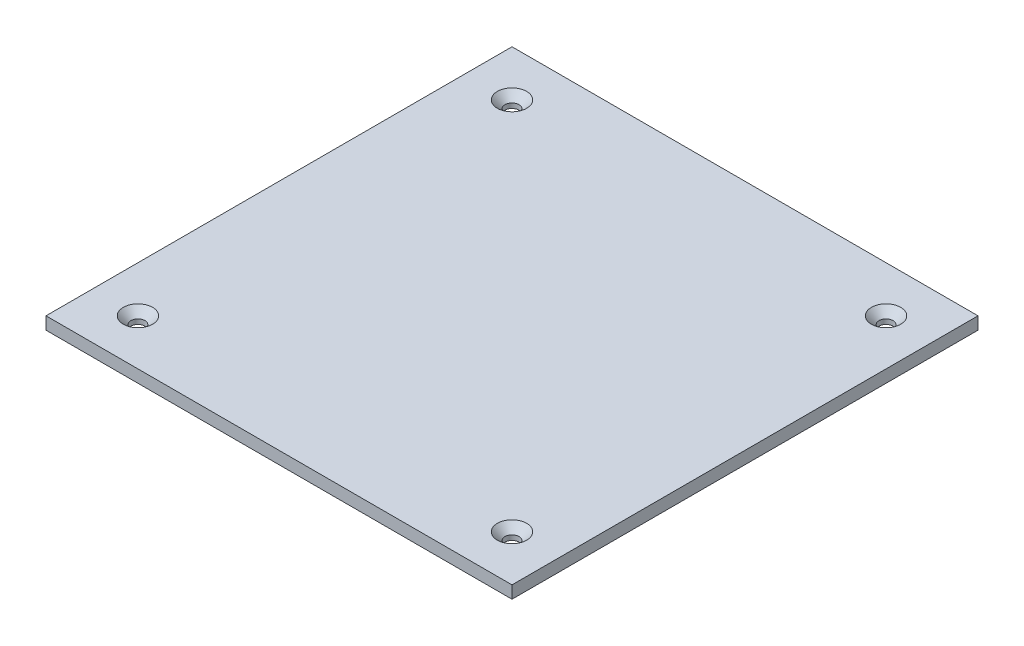
ISO-10303-21;
HEADER;
FILE_DESCRIPTION(('STEP AP214'),'2;1');
FILE_NAME('part.step','',(''),(''),'','','');
FILE_SCHEMA(('AUTOMOTIVE_DESIGN { 1 0 10303 214 1 1 1 1 }'));
ENDSEC;
DATA;
#1=APPLICATION_CONTEXT('core data for automotive mechanical design processes');
#2=APPLICATION_PROTOCOL_DEFINITION('international standard','automotive_design',2000,#1);
#3=PRODUCT_CONTEXT('',#1,'mechanical');
#4=PRODUCT('Part','Part','',(#3));
#5=PRODUCT_RELATED_PRODUCT_CATEGORY('part','',(#4));
#6=PRODUCT_DEFINITION_FORMATION('','',#4);
#7=PRODUCT_DEFINITION_CONTEXT('part definition',#1,'design');
#8=PRODUCT_DEFINITION('design','',#6,#7);
#9=PRODUCT_DEFINITION_SHAPE('','',#8);
#10=(LENGTH_UNIT() NAMED_UNIT(*) SI_UNIT(.MILLI.,.METRE.));
#11=(NAMED_UNIT(*) PLANE_ANGLE_UNIT() SI_UNIT($,.RADIAN.));
#12=(NAMED_UNIT(*) SI_UNIT($,.STERADIAN.) SOLID_ANGLE_UNIT());
#13=UNCERTAINTY_MEASURE_WITH_UNIT(LENGTH_MEASURE(1.E-05),#10,'distance_accuracy_value','');
#14=(GEOMETRIC_REPRESENTATION_CONTEXT(3) GLOBAL_UNCERTAINTY_ASSIGNED_CONTEXT((#13)) GLOBAL_UNIT_ASSIGNED_CONTEXT((#10,
#11,#12)) REPRESENTATION_CONTEXT('',''));
#15=CARTESIAN_POINT('',(0.,0.,0.));
#16=DIRECTION('',(0.,0.,1.));
#17=DIRECTION('',(1.,0.,0.));
#18=AXIS2_PLACEMENT_3D('',#15,#16,#17);
#19=CARTESIAN_POINT('',(-74.75,-4.,-74.75));
#20=DIRECTION('',(-1.,0.,0.));
#21=DIRECTION('',(0.,0.,1.));
#22=AXIS2_PLACEMENT_3D('',#19,#20,#21);
#23=PLANE('',#22);
#24=DIRECTION('',(0.,0.,1.));
#25=VECTOR('',#24,1.);
#26=CARTESIAN_POINT('',(-74.75,0.,-74.75));
#27=LINE('',#26,#25);
#28=CARTESIAN_POINT('',(-74.75,0.,-74.75));
#29=VERTEX_POINT('',#28);
#30=CARTESIAN_POINT('',(-74.75,0.,74.75));
#31=VERTEX_POINT('',#30);
#32=EDGE_CURVE('E101',#29,#31,#27,.T.);
#33=ORIENTED_EDGE('',*,*,#32,.F.);
#34=DIRECTION('',(0.,1.,0.));
#35=VECTOR('',#34,1.);
#36=CARTESIAN_POINT('',(-74.75,-4.,-74.75));
#37=LINE('',#36,#35);
#38=CARTESIAN_POINT('',(-74.75,-4.,-74.75));
#39=VERTEX_POINT('',#38);
#40=EDGE_CURVE('E11',#39,#29,#37,.T.);
#41=ORIENTED_EDGE('',*,*,#40,.F.);
#42=DIRECTION('',(0.,0.,1.));
#43=VECTOR('',#42,1.);
#44=CARTESIAN_POINT('',(-74.75,-4.,-74.75));
#45=LINE('',#44,#43);
#46=CARTESIAN_POINT('',(-74.75,-4.,74.75));
#47=VERTEX_POINT('',#46);
#48=EDGE_CURVE('E94',#39,#47,#45,.T.);
#49=ORIENTED_EDGE('',*,*,#48,.T.);
#50=DIRECTION('',(0.,1.,0.));
#51=VECTOR('',#50,1.);
#52=CARTESIAN_POINT('',(-74.75,-4.,74.75));
#53=LINE('',#52,#51);
#54=EDGE_CURVE('E39',#47,#31,#53,.T.);
#55=ORIENTED_EDGE('',*,*,#54,.T.);
#56=EDGE_LOOP('',(#33,#41,#49,#55));
#57=FACE_BOUND('',#56,.T.);
#58=ADVANCED_FACE('F36',(#57),#23,.T.);
#59=CARTESIAN_POINT('',(-74.75,-4.,-74.75));
#60=DIRECTION('',(0.,0.,-1.));
#61=DIRECTION('',(-1.,0.,0.));
#62=AXIS2_PLACEMENT_3D('',#59,#60,#61);
#63=PLANE('',#62);
#64=DIRECTION('',(-1.,0.,0.));
#65=VECTOR('',#64,1.);
#66=CARTESIAN_POINT('',(-74.75,0.,-74.75));
#67=LINE('',#66,#65);
#68=CARTESIAN_POINT('',(74.75,0.,-74.75));
#69=VERTEX_POINT('',#68);
#70=EDGE_CURVE('E96',#69,#29,#67,.T.);
#71=ORIENTED_EDGE('',*,*,#70,.F.);
#72=DIRECTION('',(0.,1.,0.));
#73=VECTOR('',#72,1.);
#74=CARTESIAN_POINT('',(74.75,-4.,-74.75));
#75=LINE('',#74,#73);
#76=CARTESIAN_POINT('',(74.75,-4.,-74.75));
#77=VERTEX_POINT('',#76);
#78=EDGE_CURVE('E45',#77,#69,#75,.T.);
#79=ORIENTED_EDGE('',*,*,#78,.F.);
#80=DIRECTION('',(-1.,0.,0.));
#81=VECTOR('',#80,1.);
#82=CARTESIAN_POINT('',(-74.75,-4.,-74.75));
#83=LINE('',#82,#81);
#84=EDGE_CURVE('E91',#77,#39,#83,.T.);
#85=ORIENTED_EDGE('',*,*,#84,.T.);
#86=ORIENTED_EDGE('',*,*,#40,.T.);
#87=EDGE_LOOP('',(#71,#79,#85,#86));
#88=FACE_BOUND('',#87,.T.);
#89=ADVANCED_FACE('F112',(#88),#63,.T.);
#90=CARTESIAN_POINT('',(74.75,-4.,-74.75));
#91=DIRECTION('',(1.,0.,0.));
#92=DIRECTION('',(0.,0.,-1.));
#93=AXIS2_PLACEMENT_3D('',#90,#91,#92);
#94=PLANE('',#93);
#95=DIRECTION('',(0.,0.,-1.));
#96=VECTOR('',#95,1.);
#97=CARTESIAN_POINT('',(74.75,0.,-74.75));
#98=LINE('',#97,#96);
#99=CARTESIAN_POINT('',(74.75,0.,74.75));
#100=VERTEX_POINT('',#99);
#101=EDGE_CURVE('E86',#100,#69,#98,.T.);
#102=ORIENTED_EDGE('',*,*,#101,.F.);
#103=DIRECTION('',(0.,1.,0.));
#104=VECTOR('',#103,1.);
#105=CARTESIAN_POINT('',(74.75,-4.,74.75));
#106=LINE('',#105,#104);
#107=CARTESIAN_POINT('',(74.75,-4.,74.75));
#108=VERTEX_POINT('',#107);
#109=EDGE_CURVE('E81',#108,#100,#106,.T.);
#110=ORIENTED_EDGE('',*,*,#109,.F.);
#111=DIRECTION('',(0.,0.,-1.));
#112=VECTOR('',#111,1.);
#113=CARTESIAN_POINT('',(74.75,-4.,-74.75));
#114=LINE('',#113,#112);
#115=EDGE_CURVE('E84',#108,#77,#114,.T.);
#116=ORIENTED_EDGE('',*,*,#115,.T.);
#117=ORIENTED_EDGE('',*,*,#78,.T.);
#118=EDGE_LOOP('',(#102,#110,#116,#117));
#119=FACE_BOUND('',#118,.T.);
#120=ADVANCED_FACE('F83',(#119),#94,.T.);
#121=CARTESIAN_POINT('',(-74.75,-4.,74.75));
#122=DIRECTION('',(0.,0.,1.));
#123=DIRECTION('',(1.,0.,0.));
#124=AXIS2_PLACEMENT_3D('',#121,#122,#123);
#125=PLANE('',#124);
#126=DIRECTION('',(1.,0.,0.));
#127=VECTOR('',#126,1.);
#128=CARTESIAN_POINT('',(-74.75,0.,74.75));
#129=LINE('',#128,#127);
#130=EDGE_CURVE('E104',#31,#100,#129,.T.);
#131=ORIENTED_EDGE('',*,*,#130,.F.);
#132=ORIENTED_EDGE('',*,*,#54,.F.);
#133=DIRECTION('',(1.,0.,0.));
#134=VECTOR('',#133,1.);
#135=CARTESIAN_POINT('',(-74.75,-4.,74.75));
#136=LINE('',#135,#134);
#137=EDGE_CURVE('E90',#47,#108,#136,.T.);
#138=ORIENTED_EDGE('',*,*,#137,.T.);
#139=ORIENTED_EDGE('',*,*,#109,.T.);
#140=EDGE_LOOP('',(#131,#132,#138,#139));
#141=FACE_BOUND('',#140,.T.);
#142=ADVANCED_FACE('F93',(#141),#125,.T.);
#143=CARTESIAN_POINT('',(0.,-4.,0.));
#144=DIRECTION('',(0.,1.,0.));
#145=DIRECTION('',(0.,0.,1.));
#146=AXIS2_PLACEMENT_3D('',#143,#144,#145);
#147=PLANE('',#146);
#148=CARTESIAN_POINT('',(60.,-4.,-60.));
#149=DIRECTION('',(0.,1.,0.));
#150=DIRECTION('',(0.,0.,1.));
#151=AXIS2_PLACEMENT_3D('',#148,#149,#150);
#152=CIRCLE('',#151,2.24999999999999);
#153=CARTESIAN_POINT('',(60.,-4.,-57.75));
#154=VERTEX_POINT('',#153);
#155=EDGE_CURVE('E175',#154,#154,#152,.T.);
#156=ORIENTED_EDGE('',*,*,#155,.T.);
#157=EDGE_LOOP('',(#156));
#158=FACE_BOUND('',#157,.T.);
#159=CARTESIAN_POINT('',(-60.,-4.,-60.));
#160=DIRECTION('',(0.,1.,0.));
#161=DIRECTION('',(0.,0.,1.));
#162=AXIS2_PLACEMENT_3D('',#159,#160,#161);
#163=CIRCLE('',#162,2.24999999999999);
#164=CARTESIAN_POINT('',(-60.,-4.,-57.75));
#165=VERTEX_POINT('',#164);
#166=EDGE_CURVE('E185',#165,#165,#163,.T.);
#167=ORIENTED_EDGE('',*,*,#166,.T.);
#168=EDGE_LOOP('',(#167));
#169=FACE_BOUND('',#168,.T.);
#170=CARTESIAN_POINT('',(-60.,-4.,60.));
#171=DIRECTION('',(0.,1.,0.));
#172=DIRECTION('',(0.,0.,1.));
#173=AXIS2_PLACEMENT_3D('',#170,#171,#172);
#174=CIRCLE('',#173,2.24999999999999);
#175=CARTESIAN_POINT('',(-60.,-4.,62.25));
#176=VERTEX_POINT('',#175);
#177=EDGE_CURVE('E194',#176,#176,#174,.T.);
#178=ORIENTED_EDGE('',*,*,#177,.T.);
#179=EDGE_LOOP('',(#178));
#180=FACE_BOUND('',#179,.T.);
#181=CARTESIAN_POINT('',(60.,-4.,60.));
#182=DIRECTION('',(0.,1.,0.));
#183=DIRECTION('',(0.,0.,1.));
#184=AXIS2_PLACEMENT_3D('',#181,#182,#183);
#185=CIRCLE('',#184,2.24999999999999);
#186=CARTESIAN_POINT('',(60.,-4.,62.25));
#187=VERTEX_POINT('',#186);
#188=EDGE_CURVE('E105',#187,#187,#185,.T.);
#189=ORIENTED_EDGE('',*,*,#188,.T.);
#190=EDGE_LOOP('',(#189));
#191=FACE_BOUND('',#190,.T.);
#192=ORIENTED_EDGE('',*,*,#48,.F.);
#193=ORIENTED_EDGE('',*,*,#84,.F.);
#194=ORIENTED_EDGE('',*,*,#115,.F.);
#195=ORIENTED_EDGE('',*,*,#137,.F.);
#196=EDGE_LOOP('',(#192,#193,#194,#195));
#197=FACE_BOUND('',#196,.T.);
#198=ADVANCED_FACE('F89',(#158,#169,#180,#191,#197),#147,.F.);
#199=CARTESIAN_POINT('',(0.,0.,0.));
#200=DIRECTION('',(0.,1.,0.));
#201=DIRECTION('',(0.,0.,1.));
#202=AXIS2_PLACEMENT_3D('',#199,#200,#201);
#203=PLANE('',#202);
#204=CARTESIAN_POINT('',(60.,0.,-60.));
#205=DIRECTION('',(0.,1.,0.));
#206=DIRECTION('',(0.,0.,1.));
#207=AXIS2_PLACEMENT_3D('',#204,#205,#206);
#208=CIRCLE('',#207,4.7);
#209=CARTESIAN_POINT('',(60.,0.,-55.3));
#210=VERTEX_POINT('',#209);
#211=EDGE_CURVE('E173',#210,#210,#208,.T.);
#212=ORIENTED_EDGE('',*,*,#211,.F.);
#213=EDGE_LOOP('',(#212));
#214=FACE_BOUND('',#213,.T.);
#215=CARTESIAN_POINT('',(-60.,0.,-60.));
#216=DIRECTION('',(0.,1.,0.));
#217=DIRECTION('',(0.,0.,1.));
#218=AXIS2_PLACEMENT_3D('',#215,#216,#217);
#219=CIRCLE('',#218,4.7);
#220=CARTESIAN_POINT('',(-60.,0.,-55.3));
#221=VERTEX_POINT('',#220);
#222=EDGE_CURVE('E179',#221,#221,#219,.T.);
#223=ORIENTED_EDGE('',*,*,#222,.F.);
#224=EDGE_LOOP('',(#223));
#225=FACE_BOUND('',#224,.T.);
#226=CARTESIAN_POINT('',(-60.,0.,60.));
#227=DIRECTION('',(0.,1.,0.));
#228=DIRECTION('',(0.,0.,1.));
#229=AXIS2_PLACEMENT_3D('',#226,#227,#228);
#230=CIRCLE('',#229,4.7);
#231=CARTESIAN_POINT('',(-60.,0.,64.7));
#232=VERTEX_POINT('',#231);
#233=EDGE_CURVE('E188',#232,#232,#230,.T.);
#234=ORIENTED_EDGE('',*,*,#233,.F.);
#235=EDGE_LOOP('',(#234));
#236=FACE_BOUND('',#235,.T.);
#237=CARTESIAN_POINT('',(60.,0.,60.));
#238=DIRECTION('',(0.,1.,0.));
#239=DIRECTION('',(0.,0.,1.));
#240=AXIS2_PLACEMENT_3D('',#237,#238,#239);
#241=CIRCLE('',#240,4.7);
#242=CARTESIAN_POINT('',(60.,0.,64.7));
#243=VERTEX_POINT('',#242);
#244=EDGE_CURVE('E197',#243,#243,#241,.T.);
#245=ORIENTED_EDGE('',*,*,#244,.F.);
#246=EDGE_LOOP('',(#245));
#247=FACE_BOUND('',#246,.T.);
#248=ORIENTED_EDGE('',*,*,#32,.T.);
#249=ORIENTED_EDGE('',*,*,#130,.T.);
#250=ORIENTED_EDGE('',*,*,#101,.T.);
#251=ORIENTED_EDGE('',*,*,#70,.T.);
#252=EDGE_LOOP('',(#248,#249,#250,#251));
#253=FACE_BOUND('',#252,.T.);
#254=ADVANCED_FACE('F111',(#214,#225,#236,#247,#253),#203,.T.);
#255=CARTESIAN_POINT('',(60.,0.,60.));
#256=DIRECTION('',(0.,1.,0.));
#257=DIRECTION('',(0.,0.,1.));
#258=AXIS2_PLACEMENT_3D('',#255,#256,#257);
#259=CYLINDRICAL_SURFACE('',#258,2.25);
#260=ORIENTED_EDGE('',*,*,#188,.F.);
#261=EDGE_LOOP('',(#260));
#262=FACE_BOUND('',#261,.T.);
#263=CARTESIAN_POINT('',(60.,-2.45,60.));
#264=DIRECTION('',(0.,1.,0.));
#265=DIRECTION('',(0.,0.,1.));
#266=AXIS2_PLACEMENT_3D('',#263,#264,#265);
#267=CIRCLE('',#266,2.25);
#268=CARTESIAN_POINT('',(60.,-2.45,62.25));
#269=VERTEX_POINT('',#268);
#270=EDGE_CURVE('E200',#269,#269,#267,.T.);
#271=ORIENTED_EDGE('',*,*,#270,.T.);
#272=EDGE_LOOP('',(#271));
#273=FACE_BOUND('',#272,.T.);
#274=ADVANCED_FACE('F130',(#262,#273),#259,.F.);
#275=CARTESIAN_POINT('',(60.,0.,60.));
#276=DIRECTION('',(0.,1.,0.));
#277=DIRECTION('',(0.,0.,1.));
#278=AXIS2_PLACEMENT_3D('',#275,#276,#277);
#279=CONICAL_SURFACE('',#278,4.7,0.785398163397449);
#280=ORIENTED_EDGE('',*,*,#270,.F.);
#281=EDGE_LOOP('',(#280));
#282=FACE_BOUND('',#281,.T.);
#283=ORIENTED_EDGE('',*,*,#244,.T.);
#284=EDGE_LOOP('',(#283));
#285=FACE_BOUND('',#284,.T.);
#286=ADVANCED_FACE('F137',(#282,#285),#279,.F.);
#287=CARTESIAN_POINT('',(-60.,0.,60.));
#288=DIRECTION('',(0.,1.,0.));
#289=DIRECTION('',(0.,0.,1.));
#290=AXIS2_PLACEMENT_3D('',#287,#288,#289);
#291=CYLINDRICAL_SURFACE('',#290,2.25);
#292=ORIENTED_EDGE('',*,*,#177,.F.);
#293=EDGE_LOOP('',(#292));
#294=FACE_BOUND('',#293,.T.);
#295=CARTESIAN_POINT('',(-60.,-2.45,60.));
#296=DIRECTION('',(0.,1.,0.));
#297=DIRECTION('',(0.,0.,1.));
#298=AXIS2_PLACEMENT_3D('',#295,#296,#297);
#299=CIRCLE('',#298,2.25);
#300=CARTESIAN_POINT('',(-60.,-2.45,62.25));
#301=VERTEX_POINT('',#300);
#302=EDGE_CURVE('E191',#301,#301,#299,.T.);
#303=ORIENTED_EDGE('',*,*,#302,.T.);
#304=EDGE_LOOP('',(#303));
#305=FACE_BOUND('',#304,.T.);
#306=ADVANCED_FACE('F141',(#294,#305),#291,.F.);
#307=CARTESIAN_POINT('',(-60.,0.,60.));
#308=DIRECTION('',(0.,1.,0.));
#309=DIRECTION('',(0.,0.,1.));
#310=AXIS2_PLACEMENT_3D('',#307,#308,#309);
#311=CONICAL_SURFACE('',#310,4.7,0.785398163397449);
#312=ORIENTED_EDGE('',*,*,#302,.F.);
#313=EDGE_LOOP('',(#312));
#314=FACE_BOUND('',#313,.T.);
#315=ORIENTED_EDGE('',*,*,#233,.T.);
#316=EDGE_LOOP('',(#315));
#317=FACE_BOUND('',#316,.T.);
#318=ADVANCED_FACE('F145',(#314,#317),#311,.F.);
#319=CARTESIAN_POINT('',(-60.,0.,-60.));
#320=DIRECTION('',(0.,1.,0.));
#321=DIRECTION('',(0.,0.,1.));
#322=AXIS2_PLACEMENT_3D('',#319,#320,#321);
#323=CYLINDRICAL_SURFACE('',#322,2.25);
#324=ORIENTED_EDGE('',*,*,#166,.F.);
#325=EDGE_LOOP('',(#324));
#326=FACE_BOUND('',#325,.T.);
#327=CARTESIAN_POINT('',(-60.,-2.45,-60.));
#328=DIRECTION('',(0.,1.,0.));
#329=DIRECTION('',(0.,0.,1.));
#330=AXIS2_PLACEMENT_3D('',#327,#328,#329);
#331=CIRCLE('',#330,2.25);
#332=CARTESIAN_POINT('',(-60.,-2.45,-57.75));
#333=VERTEX_POINT('',#332);
#334=EDGE_CURVE('E182',#333,#333,#331,.T.);
#335=ORIENTED_EDGE('',*,*,#334,.T.);
#336=EDGE_LOOP('',(#335));
#337=FACE_BOUND('',#336,.T.);
#338=ADVANCED_FACE('F149',(#326,#337),#323,.F.);
#339=CARTESIAN_POINT('',(-60.,0.,-60.));
#340=DIRECTION('',(0.,1.,0.));
#341=DIRECTION('',(0.,0.,1.));
#342=AXIS2_PLACEMENT_3D('',#339,#340,#341);
#343=CONICAL_SURFACE('',#342,4.7,0.785398163397449);
#344=ORIENTED_EDGE('',*,*,#334,.F.);
#345=EDGE_LOOP('',(#344));
#346=FACE_BOUND('',#345,.T.);
#347=ORIENTED_EDGE('',*,*,#222,.T.);
#348=EDGE_LOOP('',(#347));
#349=FACE_BOUND('',#348,.T.);
#350=ADVANCED_FACE('F153',(#346,#349),#343,.F.);
#351=CARTESIAN_POINT('',(60.,0.,-60.));
#352=DIRECTION('',(0.,1.,0.));
#353=DIRECTION('',(0.,0.,1.));
#354=AXIS2_PLACEMENT_3D('',#351,#352,#353);
#355=CYLINDRICAL_SURFACE('',#354,2.25);
#356=ORIENTED_EDGE('',*,*,#155,.F.);
#357=EDGE_LOOP('',(#356));
#358=FACE_BOUND('',#357,.T.);
#359=CARTESIAN_POINT('',(60.,-2.45,-60.));
#360=DIRECTION('',(0.,1.,0.));
#361=DIRECTION('',(0.,0.,1.));
#362=AXIS2_PLACEMENT_3D('',#359,#360,#361);
#363=CIRCLE('',#362,2.25);
#364=CARTESIAN_POINT('',(60.,-2.45,-57.75));
#365=VERTEX_POINT('',#364);
#366=EDGE_CURVE('E170',#365,#365,#363,.T.);
#367=ORIENTED_EDGE('',*,*,#366,.T.);
#368=EDGE_LOOP('',(#367));
#369=FACE_BOUND('',#368,.T.);
#370=ADVANCED_FACE('F157',(#358,#369),#355,.F.);
#371=CARTESIAN_POINT('',(60.,0.,-60.));
#372=DIRECTION('',(0.,1.,0.));
#373=DIRECTION('',(0.,0.,1.));
#374=AXIS2_PLACEMENT_3D('',#371,#372,#373);
#375=CONICAL_SURFACE('',#374,4.7,0.785398163397447);
#376=ORIENTED_EDGE('',*,*,#366,.F.);
#377=EDGE_LOOP('',(#376));
#378=FACE_BOUND('',#377,.T.);
#379=ORIENTED_EDGE('',*,*,#211,.T.);
#380=EDGE_LOOP('',(#379));
#381=FACE_BOUND('',#380,.T.);
#382=ADVANCED_FACE('F161',(#378,#381),#375,.F.);
#383=CLOSED_SHELL('',(#58,#89,#120,#142,#198,#254,#274,#286,#306,#318,#338,#350,#370,#382));
#384=MANIFOLD_SOLID_BREP('B2',#383);
#385=ADVANCED_BREP_SHAPE_REPRESENTATION('',(#18,#384),#14);
#386=SHAPE_DEFINITION_REPRESENTATION(#9,#385);
ENDSEC;
END-ISO-10303-21;
